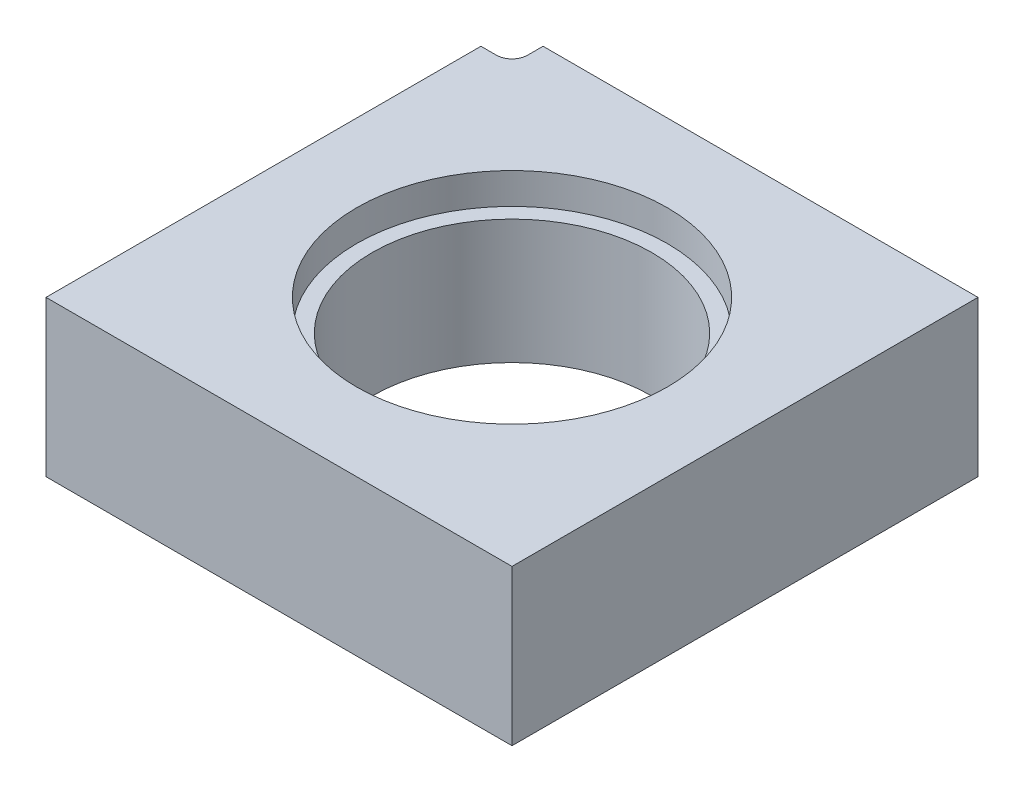
ISO-10303-21;
HEADER;
FILE_DESCRIPTION(('STEP AP214'),'2;1');
FILE_NAME('part.step','',(''),(''),'','','');
FILE_SCHEMA(('AUTOMOTIVE_DESIGN { 1 0 10303 214 1 1 1 1 }'));
ENDSEC;
DATA;
#1=APPLICATION_CONTEXT('core data for automotive mechanical design processes');
#2=APPLICATION_PROTOCOL_DEFINITION('international standard','automotive_design',2000,#1);
#3=PRODUCT_CONTEXT('',#1,'mechanical');
#4=PRODUCT('Part','Part','',(#3));
#5=PRODUCT_RELATED_PRODUCT_CATEGORY('part','',(#4));
#6=PRODUCT_DEFINITION_FORMATION('','',#4);
#7=PRODUCT_DEFINITION_CONTEXT('part definition',#1,'design');
#8=PRODUCT_DEFINITION('design','',#6,#7);
#9=PRODUCT_DEFINITION_SHAPE('','',#8);
#10=(LENGTH_UNIT() NAMED_UNIT(*) SI_UNIT(.MILLI.,.METRE.));
#11=(NAMED_UNIT(*) PLANE_ANGLE_UNIT() SI_UNIT($,.RADIAN.));
#12=(NAMED_UNIT(*) SI_UNIT($,.STERADIAN.) SOLID_ANGLE_UNIT());
#13=UNCERTAINTY_MEASURE_WITH_UNIT(LENGTH_MEASURE(1.E-05),#10,'distance_accuracy_value','');
#14=(GEOMETRIC_REPRESENTATION_CONTEXT(3) GLOBAL_UNCERTAINTY_ASSIGNED_CONTEXT((#13)) GLOBAL_UNIT_ASSIGNED_CONTEXT((#10,
#11,#12)) REPRESENTATION_CONTEXT('',''));
#15=CARTESIAN_POINT('',(0.,0.,0.));
#16=DIRECTION('',(0.,0.,1.));
#17=DIRECTION('',(1.,0.,0.));
#18=AXIS2_PLACEMENT_3D('',#15,#16,#17);
#19=CARTESIAN_POINT('',(75.,50.,75.));
#20=DIRECTION('',(-1.,0.,0.));
#21=DIRECTION('',(0.,0.,1.));
#22=AXIS2_PLACEMENT_3D('',#19,#20,#21);
#23=PLANE('',#22);
#24=DIRECTION('',(0.,0.,-1.));
#25=VECTOR('',#24,1.);
#26=CARTESIAN_POINT('',(75.,0.,75.));
#27=LINE('',#26,#25);
#28=CARTESIAN_POINT('',(75.,0.,75.));
#29=VERTEX_POINT('',#28);
#30=CARTESIAN_POINT('',(75.,0.,-75.));
#31=VERTEX_POINT('',#30);
#32=EDGE_CURVE('E144',#29,#31,#27,.T.);
#33=ORIENTED_EDGE('',*,*,#32,.T.);
#34=DIRECTION('',(0.,-1.,0.));
#35=VECTOR('',#34,1.);
#36=CARTESIAN_POINT('',(75.,50.,-75.));
#37=LINE('',#36,#35);
#38=CARTESIAN_POINT('',(75.,50.,-75.));
#39=VERTEX_POINT('',#38);
#40=EDGE_CURVE('E158',#39,#31,#37,.T.);
#41=ORIENTED_EDGE('',*,*,#40,.F.);
#42=DIRECTION('',(0.,0.,-1.));
#43=VECTOR('',#42,1.);
#44=CARTESIAN_POINT('',(75.,50.,75.));
#45=LINE('',#44,#43);
#46=CARTESIAN_POINT('',(75.,50.,75.));
#47=VERTEX_POINT('',#46);
#48=EDGE_CURVE('E132',#47,#39,#45,.T.);
#49=ORIENTED_EDGE('',*,*,#48,.F.);
#50=DIRECTION('',(0.,-1.,0.));
#51=VECTOR('',#50,1.);
#52=CARTESIAN_POINT('',(75.,50.,75.));
#53=LINE('',#52,#51);
#54=EDGE_CURVE('E143',#47,#29,#53,.T.);
#55=ORIENTED_EDGE('',*,*,#54,.T.);
#56=EDGE_LOOP('',(#33,#41,#49,#55));
#57=FACE_BOUND('',#56,.T.);
#58=ADVANCED_FACE('F37',(#57),#23,.F.);
#59=CARTESIAN_POINT('',(-75.,50.,-75.));
#60=DIRECTION('',(0.,0.,1.));
#61=DIRECTION('',(1.,0.,0.));
#62=AXIS2_PLACEMENT_3D('',#59,#60,#61);
#63=PLANE('',#62);
#64=DIRECTION('',(-1.,0.,0.));
#65=VECTOR('',#64,1.);
#66=CARTESIAN_POINT('',(-75.,0.,-75.));
#67=LINE('',#66,#65);
#68=CARTESIAN_POINT('',(-70.,0.,-75.));
#69=VERTEX_POINT('',#68);
#70=EDGE_CURVE('E147',#31,#69,#67,.T.);
#71=ORIENTED_EDGE('',*,*,#70,.T.);
#72=DIRECTION('',(0.,-1.,0.));
#73=VECTOR('',#72,1.);
#74=CARTESIAN_POINT('',(-70.,50.,-75.));
#75=LINE('',#74,#73);
#76=CARTESIAN_POINT('',(-70.,5.,-75.));
#77=VERTEX_POINT('',#76);
#78=EDGE_CURVE('E45',#69,#77,#75,.F.);
#79=ORIENTED_EDGE('',*,*,#78,.T.);
#80=DIRECTION('',(-1.,0.,0.));
#81=VECTOR('',#80,1.);
#82=CARTESIAN_POINT('',(-75.,5.,-75.));
#83=LINE('',#82,#81);
#84=CARTESIAN_POINT('',(-65.,5.,-75.));
#85=VERTEX_POINT('',#84);
#86=EDGE_CURVE('E127',#85,#77,#83,.T.);
#87=ORIENTED_EDGE('',*,*,#86,.F.);
#88=DIRECTION('',(0.,1.,0.));
#89=VECTOR('',#88,1.);
#90=CARTESIAN_POINT('',(-65.,-14.142135623731,-75.));
#91=LINE('',#90,#89);
#92=CARTESIAN_POINT('',(-65.,50.,-75.));
#93=VERTEX_POINT('',#92);
#94=EDGE_CURVE('E112',#85,#93,#91,.T.);
#95=ORIENTED_EDGE('',*,*,#94,.T.);
#96=DIRECTION('',(-1.,0.,0.));
#97=VECTOR('',#96,1.);
#98=CARTESIAN_POINT('',(-75.,50.,-75.));
#99=LINE('',#98,#97);
#100=EDGE_CURVE('E124',#39,#93,#99,.T.);
#101=ORIENTED_EDGE('',*,*,#100,.F.);
#102=ORIENTED_EDGE('',*,*,#40,.T.);
#103=EDGE_LOOP('',(#71,#79,#87,#95,#101,#102));
#104=FACE_BOUND('',#103,.T.);
#105=ADVANCED_FACE('F122',(#104),#63,.F.);
#106=CARTESIAN_POINT('',(-75.,50.,75.));
#107=DIRECTION('',(1.,0.,0.));
#108=DIRECTION('',(0.,0.,-1.));
#109=AXIS2_PLACEMENT_3D('',#106,#107,#108);
#110=PLANE('',#109);
#111=DIRECTION('',(0.,0.,1.));
#112=VECTOR('',#111,1.);
#113=CARTESIAN_POINT('',(-75.,5.,-75.));
#114=LINE('',#113,#112);
#115=CARTESIAN_POINT('',(-75.,5.,-70.));
#116=VERTEX_POINT('',#115);
#117=CARTESIAN_POINT('',(-75.,5.,-65.));
#118=VERTEX_POINT('',#117);
#119=EDGE_CURVE('E174',#116,#118,#114,.T.);
#120=ORIENTED_EDGE('',*,*,#119,.F.);
#121=DIRECTION('',(0.,-1.,0.));
#122=VECTOR('',#121,1.);
#123=CARTESIAN_POINT('',(-75.,50.,-70.));
#124=LINE('',#123,#122);
#125=CARTESIAN_POINT('',(-75.,0.,-70.));
#126=VERTEX_POINT('',#125);
#127=EDGE_CURVE('E167',#116,#126,#124,.T.);
#128=ORIENTED_EDGE('',*,*,#127,.T.);
#129=DIRECTION('',(0.,0.,1.));
#130=VECTOR('',#129,1.);
#131=CARTESIAN_POINT('',(-75.,0.,75.));
#132=LINE('',#131,#130);
#133=CARTESIAN_POINT('',(-75.,0.,75.));
#134=VERTEX_POINT('',#133);
#135=EDGE_CURVE('E150',#126,#134,#132,.T.);
#136=ORIENTED_EDGE('',*,*,#135,.T.);
#137=DIRECTION('',(0.,-1.,0.));
#138=VECTOR('',#137,1.);
#139=CARTESIAN_POINT('',(-75.,50.,75.));
#140=LINE('',#139,#138);
#141=CARTESIAN_POINT('',(-75.,50.,75.));
#142=VERTEX_POINT('',#141);
#143=EDGE_CURVE('E155',#142,#134,#140,.T.);
#144=ORIENTED_EDGE('',*,*,#143,.F.);
#145=DIRECTION('',(0.,0.,1.));
#146=VECTOR('',#145,1.);
#147=CARTESIAN_POINT('',(-75.,50.,75.));
#148=LINE('',#147,#146);
#149=CARTESIAN_POINT('',(-75.,50.,-65.));
#150=VERTEX_POINT('',#149);
#151=EDGE_CURVE('E134',#150,#142,#148,.T.);
#152=ORIENTED_EDGE('',*,*,#151,.F.);
#153=DIRECTION('',(0.,1.,0.));
#154=VECTOR('',#153,1.);
#155=CARTESIAN_POINT('',(-75.,-14.142135623731,-65.));
#156=LINE('',#155,#154);
#157=EDGE_CURVE('E212',#118,#150,#156,.T.);
#158=ORIENTED_EDGE('',*,*,#157,.F.);
#159=EDGE_LOOP('',(#120,#128,#136,#144,#152,#158));
#160=FACE_BOUND('',#159,.T.);
#161=ADVANCED_FACE('F177',(#160),#110,.F.);
#162=CARTESIAN_POINT('',(-75.,50.,75.));
#163=DIRECTION('',(0.,0.,-1.));
#164=DIRECTION('',(-1.,0.,0.));
#165=AXIS2_PLACEMENT_3D('',#162,#163,#164);
#166=PLANE('',#165);
#167=DIRECTION('',(1.,0.,0.));
#168=VECTOR('',#167,1.);
#169=CARTESIAN_POINT('',(-75.,0.,75.));
#170=LINE('',#169,#168);
#171=EDGE_CURVE('E138',#134,#29,#170,.T.);
#172=ORIENTED_EDGE('',*,*,#171,.T.);
#173=ORIENTED_EDGE('',*,*,#54,.F.);
#174=DIRECTION('',(1.,0.,0.));
#175=VECTOR('',#174,1.);
#176=CARTESIAN_POINT('',(-75.,50.,75.));
#177=LINE('',#176,#175);
#178=EDGE_CURVE('E136',#142,#47,#177,.T.);
#179=ORIENTED_EDGE('',*,*,#178,.F.);
#180=ORIENTED_EDGE('',*,*,#143,.T.);
#181=EDGE_LOOP('',(#172,#173,#179,#180));
#182=FACE_BOUND('',#181,.T.);
#183=ADVANCED_FACE('F185',(#182),#166,.F.);
#184=CARTESIAN_POINT('',(0.,50.,0.));
#185=DIRECTION('',(0.,-1.,0.));
#186=DIRECTION('',(0.,0.,-1.));
#187=AXIS2_PLACEMENT_3D('',#184,#185,#186);
#188=PLANE('',#187);
#189=CARTESIAN_POINT('',(0.,50.,0.));
#190=DIRECTION('',(0.,1.,0.));
#191=DIRECTION('',(0.,0.,1.));
#192=AXIS2_PLACEMENT_3D('',#189,#190,#191);
#193=CIRCLE('',#192,50.);
#194=CARTESIAN_POINT('',(0.,50.,50.));
#195=VERTEX_POINT('',#194);
#196=EDGE_CURVE('E218',#195,#195,#193,.T.);
#197=ORIENTED_EDGE('',*,*,#196,.F.);
#198=EDGE_LOOP('',(#197));
#199=FACE_BOUND('',#198,.T.);
#200=DIRECTION('',(0.,0.,-1.));
#201=VECTOR('',#200,1.);
#202=CARTESIAN_POINT('',(-65.,50.,-75.));
#203=LINE('',#202,#201);
#204=CARTESIAN_POINT('',(-65.,50.,-70.));
#205=VERTEX_POINT('',#204);
#206=EDGE_CURVE('E108',#205,#93,#203,.T.);
#207=ORIENTED_EDGE('',*,*,#206,.F.);
#208=CARTESIAN_POINT('',(-70.,50.,-70.));
#209=DIRECTION('',(0.,-1.,0.));
#210=DIRECTION('',(0.,0.,-1.));
#211=AXIS2_PLACEMENT_3D('',#208,#209,#210);
#212=CIRCLE('',#211,5.);
#213=CARTESIAN_POINT('',(-70.,50.,-65.));
#214=VERTEX_POINT('',#213);
#215=EDGE_CURVE('E12',#205,#214,#212,.T.);
#216=ORIENTED_EDGE('',*,*,#215,.T.);
#217=DIRECTION('',(1.,0.,0.));
#218=VECTOR('',#217,1.);
#219=CARTESIAN_POINT('',(-75.,50.,-65.));
#220=LINE('',#219,#218);
#221=EDGE_CURVE('E119',#150,#214,#220,.T.);
#222=ORIENTED_EDGE('',*,*,#221,.F.);
#223=ORIENTED_EDGE('',*,*,#151,.T.);
#224=ORIENTED_EDGE('',*,*,#178,.T.);
#225=ORIENTED_EDGE('',*,*,#48,.T.);
#226=ORIENTED_EDGE('',*,*,#100,.T.);
#227=EDGE_LOOP('',(#207,#216,#222,#223,#224,#225,#226));
#228=FACE_BOUND('',#227,.T.);
#229=ADVANCED_FACE('F130',(#199,#228),#188,.F.);
#230=CARTESIAN_POINT('',(0.,0.,0.));
#231=DIRECTION('',(0.,-1.,0.));
#232=DIRECTION('',(0.,0.,-1.));
#233=AXIS2_PLACEMENT_3D('',#230,#231,#232);
#234=PLANE('',#233);
#235=CARTESIAN_POINT('',(-70.,0.,-70.));
#236=DIRECTION('',(0.,1.,0.));
#237=DIRECTION('',(0.,0.,1.));
#238=AXIS2_PLACEMENT_3D('',#235,#236,#237);
#239=CIRCLE('',#238,2.54999999999999);
#240=CARTESIAN_POINT('',(-70.,0.,-67.45));
#241=VERTEX_POINT('',#240);
#242=EDGE_CURVE('E336',#241,#241,#239,.T.);
#243=ORIENTED_EDGE('',*,*,#242,.T.);
#244=EDGE_LOOP('',(#243));
#245=FACE_BOUND('',#244,.T.);
#246=CARTESIAN_POINT('',(0.,0.,0.));
#247=DIRECTION('',(0.,1.,0.));
#248=DIRECTION('',(0.,0.,1.));
#249=AXIS2_PLACEMENT_3D('',#246,#247,#248);
#250=CIRCLE('',#249,45.);
#251=CARTESIAN_POINT('',(0.,0.,45.));
#252=VERTEX_POINT('',#251);
#253=EDGE_CURVE('E215',#252,#252,#250,.T.);
#254=ORIENTED_EDGE('',*,*,#253,.T.);
#255=EDGE_LOOP('',(#254));
#256=FACE_BOUND('',#255,.T.);
#257=ORIENTED_EDGE('',*,*,#135,.F.);
#258=CARTESIAN_POINT('',(-70.,0.,-70.));
#259=DIRECTION('',(0.,-1.,0.));
#260=DIRECTION('',(0.,0.,-1.));
#261=AXIS2_PLACEMENT_3D('',#258,#259,#260);
#262=CIRCLE('',#261,5.);
#263=EDGE_CURVE('E52',#126,#69,#262,.T.);
#264=ORIENTED_EDGE('',*,*,#263,.T.);
#265=ORIENTED_EDGE('',*,*,#70,.F.);
#266=ORIENTED_EDGE('',*,*,#32,.F.);
#267=ORIENTED_EDGE('',*,*,#171,.F.);
#268=EDGE_LOOP('',(#257,#264,#265,#266,#267));
#269=FACE_BOUND('',#268,.T.);
#270=ADVANCED_FACE('F181',(#245,#256,#269),#234,.T.);
#271=CARTESIAN_POINT('',(0.,40.,0.));
#272=DIRECTION('',(0.,1.,0.));
#273=DIRECTION('',(0.,0.,1.));
#274=AXIS2_PLACEMENT_3D('',#271,#272,#273);
#275=CYLINDRICAL_SURFACE('',#274,50.);
#276=CARTESIAN_POINT('',(0.,40.,0.));
#277=DIRECTION('',(0.,1.,0.));
#278=DIRECTION('',(0.,0.,1.));
#279=AXIS2_PLACEMENT_3D('',#276,#277,#278);
#280=CIRCLE('',#279,50.);
#281=CARTESIAN_POINT('',(0.,40.,50.));
#282=VERTEX_POINT('',#281);
#283=EDGE_CURVE('E148',#282,#282,#280,.T.);
#284=ORIENTED_EDGE('',*,*,#283,.F.);
#285=EDGE_LOOP('',(#284));
#286=FACE_BOUND('',#285,.T.);
#287=ORIENTED_EDGE('',*,*,#196,.T.);
#288=EDGE_LOOP('',(#287));
#289=FACE_BOUND('',#288,.T.);
#290=ADVANCED_FACE('F225',(#286,#289),#275,.F.);
#291=CARTESIAN_POINT('',(0.,40.,0.));
#292=DIRECTION('',(0.,1.,0.));
#293=DIRECTION('',(0.,0.,1.));
#294=AXIS2_PLACEMENT_3D('',#291,#292,#293);
#295=PLANE('',#294);
#296=CARTESIAN_POINT('',(0.,40.,0.));
#297=DIRECTION('',(0.,1.,0.));
#298=DIRECTION('',(0.,0.,1.));
#299=AXIS2_PLACEMENT_3D('',#296,#297,#298);
#300=CIRCLE('',#299,45.);
#301=CARTESIAN_POINT('',(0.,40.,45.));
#302=VERTEX_POINT('',#301);
#303=EDGE_CURVE('E214',#302,#302,#300,.T.);
#304=ORIENTED_EDGE('',*,*,#303,.F.);
#305=EDGE_LOOP('',(#304));
#306=FACE_BOUND('',#305,.T.);
#307=ORIENTED_EDGE('',*,*,#283,.T.);
#308=EDGE_LOOP('',(#307));
#309=FACE_BOUND('',#308,.T.);
#310=ADVANCED_FACE('F259',(#306,#309),#295,.T.);
#311=CARTESIAN_POINT('',(0.,0.,0.));
#312=DIRECTION('',(0.,1.,0.));
#313=DIRECTION('',(0.,0.,1.));
#314=AXIS2_PLACEMENT_3D('',#311,#312,#313);
#315=CYLINDRICAL_SURFACE('',#314,45.);
#316=ORIENTED_EDGE('',*,*,#253,.F.);
#317=EDGE_LOOP('',(#316));
#318=FACE_BOUND('',#317,.T.);
#319=ORIENTED_EDGE('',*,*,#303,.T.);
#320=EDGE_LOOP('',(#319));
#321=FACE_BOUND('',#320,.T.);
#322=ADVANCED_FACE('F269',(#318,#321),#315,.F.);
#323=CARTESIAN_POINT('',(0.,5.,0.));
#324=DIRECTION('',(0.,-1.,0.));
#325=DIRECTION('',(0.,0.,-1.));
#326=AXIS2_PLACEMENT_3D('',#323,#324,#325);
#327=PLANE('',#326);
#328=CARTESIAN_POINT('',(-70.,5.,-70.));
#329=DIRECTION('',(0.,1.,0.));
#330=DIRECTION('',(0.,0.,1.));
#331=AXIS2_PLACEMENT_3D('',#328,#329,#330);
#332=CIRCLE('',#331,2.54999999999999);
#333=CARTESIAN_POINT('',(-70.,5.,-67.45));
#334=VERTEX_POINT('',#333);
#335=EDGE_CURVE('E334',#334,#334,#332,.T.);
#336=ORIENTED_EDGE('',*,*,#335,.F.);
#337=EDGE_LOOP('',(#336));
#338=FACE_BOUND('',#337,.T.);
#339=DIRECTION('',(1.,0.,0.));
#340=VECTOR('',#339,1.);
#341=CARTESIAN_POINT('',(-75.,5.,-65.));
#342=LINE('',#341,#340);
#343=CARTESIAN_POINT('',(-70.,5.,-65.));
#344=VERTEX_POINT('',#343);
#345=EDGE_CURVE('E118',#118,#344,#342,.T.);
#346=ORIENTED_EDGE('',*,*,#345,.T.);
#347=CARTESIAN_POINT('',(-70.,5.,-70.));
#348=DIRECTION('',(0.,-1.,0.));
#349=DIRECTION('',(0.,0.,-1.));
#350=AXIS2_PLACEMENT_3D('',#347,#348,#349);
#351=CIRCLE('',#350,5.);
#352=CARTESIAN_POINT('',(-65.,5.,-70.));
#353=VERTEX_POINT('',#352);
#354=EDGE_CURVE('E165',#344,#353,#351,.F.);
#355=ORIENTED_EDGE('',*,*,#354,.T.);
#356=DIRECTION('',(0.,0.,-1.));
#357=VECTOR('',#356,1.);
#358=CARTESIAN_POINT('',(-65.,5.,-75.));
#359=LINE('',#358,#357);
#360=EDGE_CURVE('E128',#353,#85,#359,.T.);
#361=ORIENTED_EDGE('',*,*,#360,.T.);
#362=ORIENTED_EDGE('',*,*,#86,.T.);
#363=CARTESIAN_POINT('',(-70.,5.,-70.));
#364=DIRECTION('',(0.,-1.,0.));
#365=DIRECTION('',(0.,0.,-1.));
#366=AXIS2_PLACEMENT_3D('',#363,#364,#365);
#367=CIRCLE('',#366,5.);
#368=EDGE_CURVE('E163',#77,#116,#367,.F.);
#369=ORIENTED_EDGE('',*,*,#368,.T.);
#370=ORIENTED_EDGE('',*,*,#119,.T.);
#371=EDGE_LOOP('',(#346,#355,#361,#362,#369,#370));
#372=FACE_BOUND('',#371,.T.);
#373=ADVANCED_FACE('F172',(#338,#372),#327,.F.);
#374=CARTESIAN_POINT('',(-75.,-14.142135623731,-65.));
#375=DIRECTION('',(0.,0.,1.));
#376=DIRECTION('',(1.,0.,0.));
#377=AXIS2_PLACEMENT_3D('',#374,#375,#376);
#378=PLANE('',#377);
#379=ORIENTED_EDGE('',*,*,#221,.T.);
#380=DIRECTION('',(0.,1.,0.));
#381=VECTOR('',#380,1.);
#382=CARTESIAN_POINT('',(-70.,5.,-65.));
#383=LINE('',#382,#381);
#384=EDGE_CURVE('E161',#214,#344,#383,.F.);
#385=ORIENTED_EDGE('',*,*,#384,.T.);
#386=ORIENTED_EDGE('',*,*,#345,.F.);
#387=ORIENTED_EDGE('',*,*,#157,.T.);
#388=EDGE_LOOP('',(#379,#385,#386,#387));
#389=FACE_BOUND('',#388,.T.);
#390=ADVANCED_FACE('F304',(#389),#378,.F.);
#391=CARTESIAN_POINT('',(-65.,-14.142135623731,-75.));
#392=DIRECTION('',(1.,0.,0.));
#393=DIRECTION('',(0.,0.,-1.));
#394=AXIS2_PLACEMENT_3D('',#391,#392,#393);
#395=PLANE('',#394);
#396=ORIENTED_EDGE('',*,*,#360,.F.);
#397=DIRECTION('',(0.,1.,0.));
#398=VECTOR('',#397,1.);
#399=CARTESIAN_POINT('',(-65.,50.,-70.));
#400=LINE('',#399,#398);
#401=EDGE_CURVE('E115',#353,#205,#400,.T.);
#402=ORIENTED_EDGE('',*,*,#401,.T.);
#403=ORIENTED_EDGE('',*,*,#206,.T.);
#404=ORIENTED_EDGE('',*,*,#94,.F.);
#405=EDGE_LOOP('',(#396,#402,#403,#404));
#406=FACE_BOUND('',#405,.T.);
#407=ADVANCED_FACE('F111',(#406),#395,.F.);
#408=CARTESIAN_POINT('',(-70.,0.,-70.));
#409=DIRECTION('',(0.,1.,0.));
#410=DIRECTION('',(0.,0.,1.));
#411=AXIS2_PLACEMENT_3D('',#408,#409,#410);
#412=CYLINDRICAL_SURFACE('',#411,2.54999999999999);
#413=ORIENTED_EDGE('',*,*,#242,.F.);
#414=EDGE_LOOP('',(#413));
#415=FACE_BOUND('',#414,.T.);
#416=ORIENTED_EDGE('',*,*,#335,.T.);
#417=EDGE_LOOP('',(#416));
#418=FACE_BOUND('',#417,.T.);
#419=ADVANCED_FACE('F197',(#415,#418),#412,.F.);
#420=CARTESIAN_POINT('',(-70.,-14.142135623731,-70.));
#421=DIRECTION('',(0.,-1.,0.));
#422=DIRECTION('',(0.,0.,-1.));
#423=AXIS2_PLACEMENT_3D('',#420,#421,#422);
#424=CYLINDRICAL_SURFACE('',#423,5.);
#425=ORIENTED_EDGE('',*,*,#354,.F.);
#426=ORIENTED_EDGE('',*,*,#384,.F.);
#427=ORIENTED_EDGE('',*,*,#215,.F.);
#428=ORIENTED_EDGE('',*,*,#401,.F.);
#429=EDGE_LOOP('',(#425,#426,#427,#428));
#430=FACE_BOUND('',#429,.T.);
#431=ADVANCED_FACE('F195',(#430),#424,.F.);
#432=CARTESIAN_POINT('',(-70.,50.,-70.));
#433=DIRECTION('',(0.,-1.,0.));
#434=DIRECTION('',(0.,0.,-1.));
#435=AXIS2_PLACEMENT_3D('',#432,#433,#434);
#436=CYLINDRICAL_SURFACE('',#435,5.);
#437=ORIENTED_EDGE('',*,*,#368,.F.);
#438=ORIENTED_EDGE('',*,*,#78,.F.);
#439=ORIENTED_EDGE('',*,*,#263,.F.);
#440=ORIENTED_EDGE('',*,*,#127,.F.);
#441=EDGE_LOOP('',(#437,#438,#439,#440));
#442=FACE_BOUND('',#441,.T.);
#443=ADVANCED_FACE('F39',(#442),#436,.T.);
#444=CLOSED_SHELL('',(#58,#105,#161,#183,#229,#270,#290,#310,#322,#373,#390,#407,#419,#431,#443));
#445=MANIFOLD_SOLID_BREP('B2',#444);
#446=ADVANCED_BREP_SHAPE_REPRESENTATION('',(#18,#445),#14);
#447=SHAPE_DEFINITION_REPRESENTATION(#9,#446);
ENDSEC;
END-ISO-10303-21;
